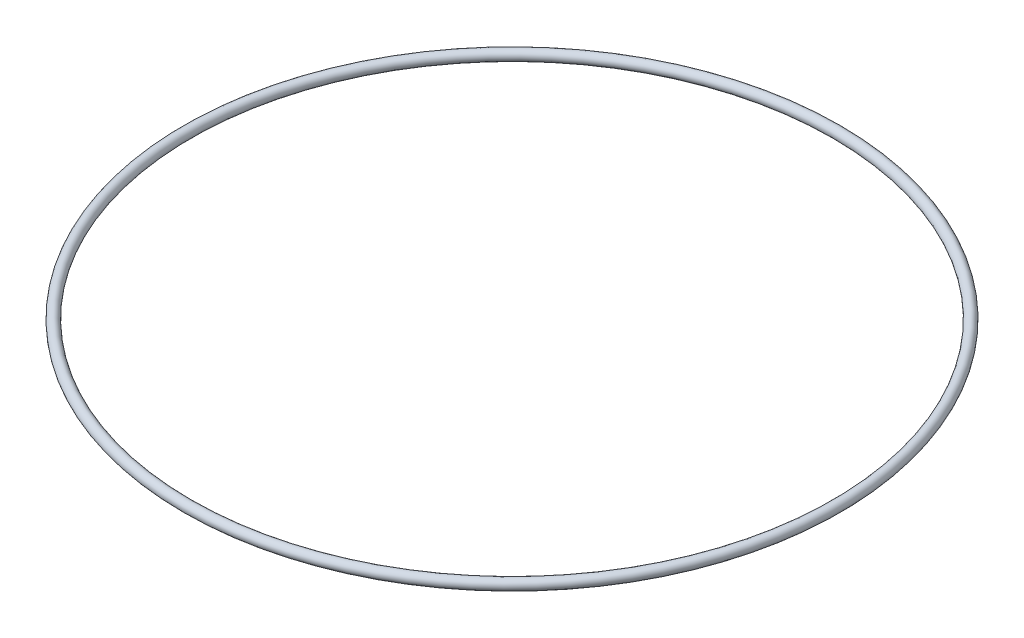
ISO-10303-21;
HEADER;
FILE_DESCRIPTION(('STEP AP214'),'2;1');
FILE_NAME('part.step','',(''),(''),'','','');
FILE_SCHEMA(('AUTOMOTIVE_DESIGN { 1 0 10303 214 1 1 1 1 }'));
ENDSEC;
DATA;
#1=APPLICATION_CONTEXT('core data for automotive mechanical design processes');
#2=APPLICATION_PROTOCOL_DEFINITION('international standard','automotive_design',2000,#1);
#3=PRODUCT_CONTEXT('',#1,'mechanical');
#4=PRODUCT('Part','Part','',(#3));
#5=PRODUCT_RELATED_PRODUCT_CATEGORY('part','',(#4));
#6=PRODUCT_DEFINITION_FORMATION('','',#4);
#7=PRODUCT_DEFINITION_CONTEXT('part definition',#1,'design');
#8=PRODUCT_DEFINITION('design','',#6,#7);
#9=PRODUCT_DEFINITION_SHAPE('','',#8);
#10=(LENGTH_UNIT() NAMED_UNIT(*) SI_UNIT(.MILLI.,.METRE.));
#11=(NAMED_UNIT(*) PLANE_ANGLE_UNIT() SI_UNIT($,.RADIAN.));
#12=(NAMED_UNIT(*) SI_UNIT($,.STERADIAN.) SOLID_ANGLE_UNIT());
#13=UNCERTAINTY_MEASURE_WITH_UNIT(LENGTH_MEASURE(1.E-05),#10,'distance_accuracy_value','');
#14=(GEOMETRIC_REPRESENTATION_CONTEXT(3) GLOBAL_UNCERTAINTY_ASSIGNED_CONTEXT((#13)) GLOBAL_UNIT_ASSIGNED_CONTEXT((#10,
#11,#12)) REPRESENTATION_CONTEXT('',''));
#15=CARTESIAN_POINT('',(0.,0.,0.));
#16=DIRECTION('',(0.,0.,1.));
#17=DIRECTION('',(1.,0.,0.));
#18=AXIS2_PLACEMENT_3D('',#15,#16,#17);
#19=CARTESIAN_POINT('',(0.,0.,0.));
#20=DIRECTION('',(0.,1.,0.));
#21=DIRECTION('',(0.,0.,1.));
#22=AXIS2_PLACEMENT_3D('',#19,#20,#21);
#23=TOROIDAL_SURFACE('',#22,62.5,1.);
#24=CARTESIAN_POINT('',(0.,0.,62.5));
#25=DIRECTION('',(1.,0.,0.));
#26=DIRECTION('',(0.,0.,-1.));
#27=AXIS2_PLACEMENT_3D('',#24,#25,#26);
#28=CIRCLE('',#27,1.);
#29=CARTESIAN_POINT('',(0.,0.,63.5));
#30=VERTEX_POINT('',#29);
#31=EDGE_CURVE('E11',#30,#30,#28,.T.);
#32=CARTESIAN_POINT('',(0.,0.,0.));
#33=DIRECTION('',(0.,1.,0.));
#34=DIRECTION('',(0.,0.,1.));
#35=AXIS2_PLACEMENT_3D('',#32,#33,#34);
#36=CIRCLE('',#35,63.5);
#37=EDGE_CURVE('',#30,#30,#36,.T.);
#38=ORIENTED_EDGE('',*,*,#31,.T.);
#39=ORIENTED_EDGE('',*,*,#31,.F.);
#40=ORIENTED_EDGE('',*,*,#37,.T.);
#41=ORIENTED_EDGE('',*,*,#37,.F.);
#42=EDGE_LOOP('',(#38,#40,#39,#41));
#43=FACE_BOUND('',#42,.T.);
#44=ADVANCED_FACE('F51',(#43),#23,.T.);
#45=CLOSED_SHELL('',(#44));
#46=MANIFOLD_SOLID_BREP('B2',#45);
#47=ADVANCED_BREP_SHAPE_REPRESENTATION('',(#18,#46),#14);
#48=SHAPE_DEFINITION_REPRESENTATION(#9,#47);
ENDSEC;
END-ISO-10303-21;
